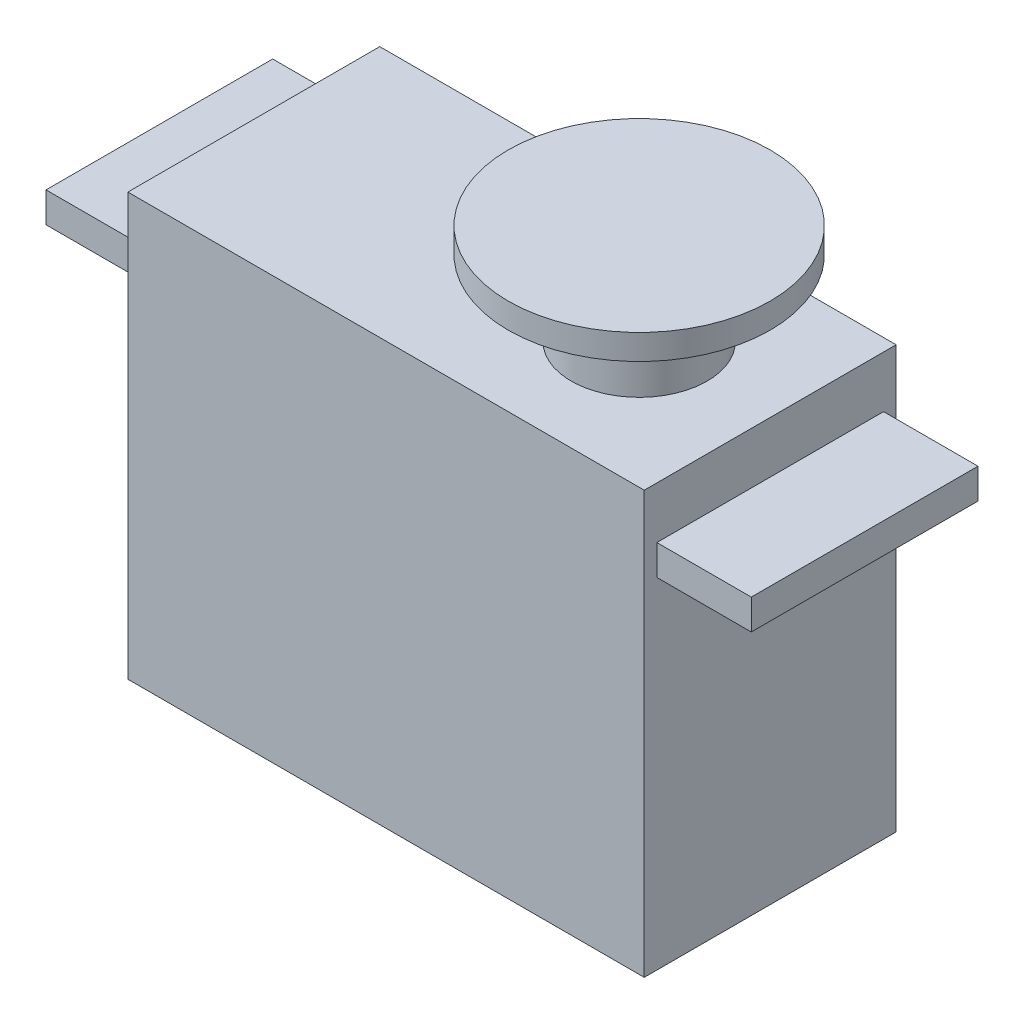
ISO-10303-21;
HEADER;
FILE_DESCRIPTION(('STEP AP214'),'2;1');
FILE_NAME('part.step','',(''),(''),'','','');
FILE_SCHEMA(('AUTOMOTIVE_DESIGN { 1 0 10303 214 1 1 1 1 }'));
ENDSEC;
DATA;
#1=APPLICATION_CONTEXT('core data for automotive mechanical design processes');
#2=APPLICATION_PROTOCOL_DEFINITION('international standard','automotive_design',2000,#1);
#3=PRODUCT_CONTEXT('',#1,'mechanical');
#4=PRODUCT('Part','Part','',(#3));
#5=PRODUCT_RELATED_PRODUCT_CATEGORY('part','',(#4));
#6=PRODUCT_DEFINITION_FORMATION('','',#4);
#7=PRODUCT_DEFINITION_CONTEXT('part definition',#1,'design');
#8=PRODUCT_DEFINITION('design','',#6,#7);
#9=PRODUCT_DEFINITION_SHAPE('','',#8);
#10=(LENGTH_UNIT() NAMED_UNIT(*) SI_UNIT(.MILLI.,.METRE.));
#11=(NAMED_UNIT(*) PLANE_ANGLE_UNIT() SI_UNIT($,.RADIAN.));
#12=(NAMED_UNIT(*) SI_UNIT($,.STERADIAN.) SOLID_ANGLE_UNIT());
#13=UNCERTAINTY_MEASURE_WITH_UNIT(LENGTH_MEASURE(1.E-05),#10,'distance_accuracy_value','');
#14=(GEOMETRIC_REPRESENTATION_CONTEXT(3) GLOBAL_UNCERTAINTY_ASSIGNED_CONTEXT((#13)) GLOBAL_UNIT_ASSIGNED_CONTEXT((#10,
#11,#12)) REPRESENTATION_CONTEXT('',''));
#15=CARTESIAN_POINT('',(0.,0.,0.));
#16=DIRECTION('',(0.,0.,1.));
#17=DIRECTION('',(1.,0.,0.));
#18=AXIS2_PLACEMENT_3D('',#15,#16,#17);
#19=CARTESIAN_POINT('',(41.,0.,20.));
#20=DIRECTION('',(-1.,0.,0.));
#21=DIRECTION('',(0.,0.,1.));
#22=AXIS2_PLACEMENT_3D('',#19,#20,#21);
#23=PLANE('',#22);
#24=DIRECTION('',(0.,1.,0.));
#25=VECTOR('',#24,1.);
#26=CARTESIAN_POINT('',(41.,0.,0.));
#27=LINE('',#26,#25);
#28=CARTESIAN_POINT('',(41.,0.,0.));
#29=VERTEX_POINT('',#28);
#30=CARTESIAN_POINT('',(41.,33.5,0.));
#31=VERTEX_POINT('',#30);
#32=EDGE_CURVE('E213',#29,#31,#27,.T.);
#33=ORIENTED_EDGE('',*,*,#32,.T.);
#34=DIRECTION('',(0.,0.,-1.));
#35=VECTOR('',#34,1.);
#36=CARTESIAN_POINT('',(41.,33.5,20.));
#37=LINE('',#36,#35);
#38=CARTESIAN_POINT('',(41.,33.5,20.));
#39=VERTEX_POINT('',#38);
#40=EDGE_CURVE('E218',#39,#31,#37,.T.);
#41=ORIENTED_EDGE('',*,*,#40,.F.);
#42=DIRECTION('',(0.,1.,0.));
#43=VECTOR('',#42,1.);
#44=CARTESIAN_POINT('',(41.,0.,20.));
#45=LINE('',#44,#43);
#46=CARTESIAN_POINT('',(41.,0.,20.));
#47=VERTEX_POINT('',#46);
#48=EDGE_CURVE('E204',#47,#39,#45,.T.);
#49=ORIENTED_EDGE('',*,*,#48,.F.);
#50=DIRECTION('',(0.,0.,-1.));
#51=VECTOR('',#50,1.);
#52=CARTESIAN_POINT('',(41.,0.,20.));
#53=LINE('',#52,#51);
#54=EDGE_CURVE('E44',#47,#29,#53,.T.);
#55=ORIENTED_EDGE('',*,*,#54,.T.);
#56=EDGE_LOOP('',(#33,#41,#49,#55));
#57=FACE_BOUND('',#56,.T.);
#58=DIRECTION('',(0.,-1.,0.));
#59=VECTOR('',#58,1.);
#60=CARTESIAN_POINT('',(41.,27.,19.));
#61=LINE('',#60,#59);
#62=CARTESIAN_POINT('',(41.,29.4,19.));
#63=VERTEX_POINT('',#62);
#64=CARTESIAN_POINT('',(41.,27.,19.));
#65=VERTEX_POINT('',#64);
#66=EDGE_CURVE('E136',#63,#65,#61,.T.);
#67=ORIENTED_EDGE('',*,*,#66,.F.);
#68=DIRECTION('',(0.,0.,1.));
#69=VECTOR('',#68,1.);
#70=CARTESIAN_POINT('',(41.,29.4,19.));
#71=LINE('',#70,#69);
#72=CARTESIAN_POINT('',(41.,29.4,1.));
#73=VERTEX_POINT('',#72);
#74=EDGE_CURVE('E172',#73,#63,#71,.T.);
#75=ORIENTED_EDGE('',*,*,#74,.F.);
#76=DIRECTION('',(0.,1.,0.));
#77=VECTOR('',#76,1.);
#78=CARTESIAN_POINT('',(41.,27.,1.));
#79=LINE('',#78,#77);
#80=CARTESIAN_POINT('',(41.,27.,1.));
#81=VERTEX_POINT('',#80);
#82=EDGE_CURVE('E182',#81,#73,#79,.T.);
#83=ORIENTED_EDGE('',*,*,#82,.F.);
#84=DIRECTION('',(0.,0.,-1.));
#85=VECTOR('',#84,1.);
#86=CARTESIAN_POINT('',(41.,27.,19.));
#87=LINE('',#86,#85);
#88=EDGE_CURVE('E59',#65,#81,#87,.T.);
#89=ORIENTED_EDGE('',*,*,#88,.F.);
#90=EDGE_LOOP('',(#67,#75,#83,#89));
#91=FACE_BOUND('',#90,.T.);
#92=ADVANCED_FACE('F36',(#57,#91),#23,.F.);
#93=CARTESIAN_POINT('',(0.,33.5,20.));
#94=DIRECTION('',(1.,0.,0.));
#95=DIRECTION('',(0.,0.,-1.));
#96=AXIS2_PLACEMENT_3D('',#93,#94,#95);
#97=PLANE('',#96);
#98=DIRECTION('',(0.,0.,1.));
#99=VECTOR('',#98,1.);
#100=CARTESIAN_POINT('',(0.,29.4,19.));
#101=LINE('',#100,#99);
#102=CARTESIAN_POINT('',(0.,29.4,1.));
#103=VERTEX_POINT('',#102);
#104=CARTESIAN_POINT('',(0.,29.4,19.));
#105=VERTEX_POINT('',#104);
#106=EDGE_CURVE('E158',#103,#105,#101,.T.);
#107=ORIENTED_EDGE('',*,*,#106,.T.);
#108=DIRECTION('',(0.,-1.,0.));
#109=VECTOR('',#108,1.);
#110=CARTESIAN_POINT('',(0.,27.,19.));
#111=LINE('',#110,#109);
#112=CARTESIAN_POINT('',(0.,27.,19.));
#113=VERTEX_POINT('',#112);
#114=EDGE_CURVE('E131',#105,#113,#111,.T.);
#115=ORIENTED_EDGE('',*,*,#114,.T.);
#116=DIRECTION('',(0.,0.,-1.));
#117=VECTOR('',#116,1.);
#118=CARTESIAN_POINT('',(0.,27.,19.));
#119=LINE('',#118,#117);
#120=CARTESIAN_POINT('',(0.,27.,1.));
#121=VERTEX_POINT('',#120);
#122=EDGE_CURVE('E147',#113,#121,#119,.T.);
#123=ORIENTED_EDGE('',*,*,#122,.T.);
#124=DIRECTION('',(0.,1.,0.));
#125=VECTOR('',#124,1.);
#126=CARTESIAN_POINT('',(0.,27.,1.));
#127=LINE('',#126,#125);
#128=EDGE_CURVE('E51',#121,#103,#127,.T.);
#129=ORIENTED_EDGE('',*,*,#128,.T.);
#130=EDGE_LOOP('',(#107,#115,#123,#129));
#131=FACE_BOUND('',#130,.T.);
#132=DIRECTION('',(0.,-1.,0.));
#133=VECTOR('',#132,1.);
#134=CARTESIAN_POINT('',(0.,33.5,0.));
#135=LINE('',#134,#133);
#136=CARTESIAN_POINT('',(0.,33.5,0.));
#137=VERTEX_POINT('',#136);
#138=CARTESIAN_POINT('',(0.,0.,0.));
#139=VERTEX_POINT('',#138);
#140=EDGE_CURVE('E197',#137,#139,#135,.T.);
#141=ORIENTED_EDGE('',*,*,#140,.T.);
#142=DIRECTION('',(0.,0.,-1.));
#143=VECTOR('',#142,1.);
#144=CARTESIAN_POINT('',(0.,0.,20.));
#145=LINE('',#144,#143);
#146=CARTESIAN_POINT('',(0.,0.,20.));
#147=VERTEX_POINT('',#146);
#148=EDGE_CURVE('E11',#147,#139,#145,.T.);
#149=ORIENTED_EDGE('',*,*,#148,.F.);
#150=DIRECTION('',(0.,-1.,0.));
#151=VECTOR('',#150,1.);
#152=CARTESIAN_POINT('',(0.,33.5,20.));
#153=LINE('',#152,#151);
#154=CARTESIAN_POINT('',(0.,33.5,20.));
#155=VERTEX_POINT('',#154);
#156=EDGE_CURVE('E198',#155,#147,#153,.T.);
#157=ORIENTED_EDGE('',*,*,#156,.F.);
#158=DIRECTION('',(0.,0.,-1.));
#159=VECTOR('',#158,1.);
#160=CARTESIAN_POINT('',(0.,33.5,20.));
#161=LINE('',#160,#159);
#162=EDGE_CURVE('E208',#155,#137,#161,.T.);
#163=ORIENTED_EDGE('',*,*,#162,.T.);
#164=EDGE_LOOP('',(#141,#149,#157,#163));
#165=FACE_BOUND('',#164,.T.);
#166=ADVANCED_FACE('F38',(#131,#165),#97,.F.);
#167=CARTESIAN_POINT('',(0.,0.,20.));
#168=DIRECTION('',(0.,1.,0.));
#169=DIRECTION('',(0.,0.,1.));
#170=AXIS2_PLACEMENT_3D('',#167,#168,#169);
#171=PLANE('',#170);
#172=DIRECTION('',(1.,0.,0.));
#173=VECTOR('',#172,1.);
#174=CARTESIAN_POINT('',(0.,0.,0.));
#175=LINE('',#174,#173);
#176=EDGE_CURVE('E211',#139,#29,#175,.T.);
#177=ORIENTED_EDGE('',*,*,#176,.T.);
#178=ORIENTED_EDGE('',*,*,#54,.F.);
#179=DIRECTION('',(1.,0.,0.));
#180=VECTOR('',#179,1.);
#181=CARTESIAN_POINT('',(0.,0.,20.));
#182=LINE('',#181,#180);
#183=EDGE_CURVE('E201',#147,#47,#182,.T.);
#184=ORIENTED_EDGE('',*,*,#183,.F.);
#185=ORIENTED_EDGE('',*,*,#148,.T.);
#186=EDGE_LOOP('',(#177,#178,#184,#185));
#187=FACE_BOUND('',#186,.T.);
#188=ADVANCED_FACE('F240',(#187),#171,.F.);
#189=CARTESIAN_POINT('',(41.,33.5,20.));
#190=DIRECTION('',(0.,-1.,0.));
#191=DIRECTION('',(1.,0.,0.));
#192=AXIS2_PLACEMENT_3D('',#189,#190,#191);
#193=PLANE('',#192);
#194=CARTESIAN_POINT('',(30.6,33.5,10.));
#195=DIRECTION('',(0.,-1.,0.));
#196=DIRECTION('',(0.,0.,-1.));
#197=AXIS2_PLACEMENT_3D('',#194,#195,#196);
#198=CIRCLE('',#197,5.4);
#199=CARTESIAN_POINT('',(30.6,33.5,4.6));
#200=VERTEX_POINT('',#199);
#201=EDGE_CURVE('E314',#200,#200,#198,.T.);
#202=ORIENTED_EDGE('',*,*,#201,.T.);
#203=EDGE_LOOP('',(#202));
#204=FACE_BOUND('',#203,.T.);
#205=DIRECTION('',(-1.,0.,0.));
#206=VECTOR('',#205,1.);
#207=CARTESIAN_POINT('',(41.,33.5,0.));
#208=LINE('',#207,#206);
#209=EDGE_CURVE('E202',#31,#137,#208,.T.);
#210=ORIENTED_EDGE('',*,*,#209,.T.);
#211=ORIENTED_EDGE('',*,*,#162,.F.);
#212=DIRECTION('',(-1.,0.,0.));
#213=VECTOR('',#212,1.);
#214=CARTESIAN_POINT('',(41.,33.5,20.));
#215=LINE('',#214,#213);
#216=EDGE_CURVE('E206',#39,#155,#215,.T.);
#217=ORIENTED_EDGE('',*,*,#216,.F.);
#218=ORIENTED_EDGE('',*,*,#40,.T.);
#219=EDGE_LOOP('',(#210,#211,#217,#218));
#220=FACE_BOUND('',#219,.T.);
#221=ADVANCED_FACE('F233',(#204,#220),#193,.F.);
#222=CARTESIAN_POINT('',(0.,0.,20.));
#223=DIRECTION('',(0.,0.,1.));
#224=DIRECTION('',(1.,0.,0.));
#225=AXIS2_PLACEMENT_3D('',#222,#223,#224);
#226=PLANE('',#225);
#227=ORIENTED_EDGE('',*,*,#156,.T.);
#228=ORIENTED_EDGE('',*,*,#183,.T.);
#229=ORIENTED_EDGE('',*,*,#48,.T.);
#230=ORIENTED_EDGE('',*,*,#216,.T.);
#231=EDGE_LOOP('',(#227,#228,#229,#230));
#232=FACE_BOUND('',#231,.T.);
#233=ADVANCED_FACE('F239',(#232),#226,.T.);
#234=CARTESIAN_POINT('',(0.,0.,0.));
#235=DIRECTION('',(0.,0.,1.));
#236=DIRECTION('',(1.,0.,0.));
#237=AXIS2_PLACEMENT_3D('',#234,#235,#236);
#238=PLANE('',#237);
#239=ORIENTED_EDGE('',*,*,#140,.F.);
#240=ORIENTED_EDGE('',*,*,#209,.F.);
#241=ORIENTED_EDGE('',*,*,#32,.F.);
#242=ORIENTED_EDGE('',*,*,#176,.F.);
#243=EDGE_LOOP('',(#239,#240,#241,#242));
#244=FACE_BOUND('',#243,.T.);
#245=ADVANCED_FACE('F230',(#244),#238,.F.);
#246=CARTESIAN_POINT('',(48.5,27.,19.));
#247=DIRECTION('',(0.,0.,-1.));
#248=DIRECTION('',(-1.,0.,0.));
#249=AXIS2_PLACEMENT_3D('',#246,#247,#248);
#250=PLANE('',#249);
#251=ORIENTED_EDGE('',*,*,#66,.T.);
#252=DIRECTION('',(-1.,0.,0.));
#253=VECTOR('',#252,1.);
#254=CARTESIAN_POINT('',(48.5,27.,19.));
#255=LINE('',#254,#253);
#256=CARTESIAN_POINT('',(48.5,27.,19.));
#257=VERTEX_POINT('',#256);
#258=EDGE_CURVE('E195',#257,#65,#255,.T.);
#259=ORIENTED_EDGE('',*,*,#258,.F.);
#260=DIRECTION('',(0.,-1.,0.));
#261=VECTOR('',#260,1.);
#262=CARTESIAN_POINT('',(48.5,27.,19.));
#263=LINE('',#262,#261);
#264=CARTESIAN_POINT('',(48.5,29.4,19.));
#265=VERTEX_POINT('',#264);
#266=EDGE_CURVE('E168',#265,#257,#263,.T.);
#267=ORIENTED_EDGE('',*,*,#266,.F.);
#268=DIRECTION('',(-1.,0.,0.));
#269=VECTOR('',#268,1.);
#270=CARTESIAN_POINT('',(48.5,29.4,19.));
#271=LINE('',#270,#269);
#272=EDGE_CURVE('E178',#265,#63,#271,.T.);
#273=ORIENTED_EDGE('',*,*,#272,.T.);
#274=EDGE_LOOP('',(#251,#259,#267,#273));
#275=FACE_BOUND('',#274,.T.);
#276=ADVANCED_FACE('F256',(#275),#250,.F.);
#277=CARTESIAN_POINT('',(48.5,27.,19.));
#278=DIRECTION('',(0.,1.,0.));
#279=DIRECTION('',(0.,0.,1.));
#280=AXIS2_PLACEMENT_3D('',#277,#278,#279);
#281=PLANE('',#280);
#282=ORIENTED_EDGE('',*,*,#88,.T.);
#283=DIRECTION('',(-1.,0.,0.));
#284=VECTOR('',#283,1.);
#285=CARTESIAN_POINT('',(48.5,27.,1.));
#286=LINE('',#285,#284);
#287=CARTESIAN_POINT('',(48.5,27.,1.));
#288=VERTEX_POINT('',#287);
#289=EDGE_CURVE('E192',#288,#81,#286,.T.);
#290=ORIENTED_EDGE('',*,*,#289,.F.);
#291=DIRECTION('',(0.,0.,-1.));
#292=VECTOR('',#291,1.);
#293=CARTESIAN_POINT('',(48.5,27.,19.));
#294=LINE('',#293,#292);
#295=EDGE_CURVE('E171',#257,#288,#294,.T.);
#296=ORIENTED_EDGE('',*,*,#295,.F.);
#297=ORIENTED_EDGE('',*,*,#258,.T.);
#298=EDGE_LOOP('',(#282,#290,#296,#297));
#299=FACE_BOUND('',#298,.T.);
#300=ADVANCED_FACE('F261',(#299),#281,.F.);
#301=CARTESIAN_POINT('',(48.5,27.,1.));
#302=DIRECTION('',(0.,0.,1.));
#303=DIRECTION('',(1.,0.,0.));
#304=AXIS2_PLACEMENT_3D('',#301,#302,#303);
#305=PLANE('',#304);
#306=ORIENTED_EDGE('',*,*,#82,.T.);
#307=DIRECTION('',(-1.,0.,0.));
#308=VECTOR('',#307,1.);
#309=CARTESIAN_POINT('',(48.5,29.4,1.));
#310=LINE('',#309,#308);
#311=CARTESIAN_POINT('',(48.5,29.4,1.));
#312=VERTEX_POINT('',#311);
#313=EDGE_CURVE('E189',#312,#73,#310,.T.);
#314=ORIENTED_EDGE('',*,*,#313,.F.);
#315=DIRECTION('',(0.,1.,0.));
#316=VECTOR('',#315,1.);
#317=CARTESIAN_POINT('',(48.5,27.,1.));
#318=LINE('',#317,#316);
#319=EDGE_CURVE('E174',#288,#312,#318,.T.);
#320=ORIENTED_EDGE('',*,*,#319,.F.);
#321=ORIENTED_EDGE('',*,*,#289,.T.);
#322=EDGE_LOOP('',(#306,#314,#320,#321));
#323=FACE_BOUND('',#322,.T.);
#324=ADVANCED_FACE('F265',(#323),#305,.F.);
#325=CARTESIAN_POINT('',(48.5,29.4,19.));
#326=DIRECTION('',(0.,-1.,0.));
#327=DIRECTION('',(0.,0.,-1.));
#328=AXIS2_PLACEMENT_3D('',#325,#326,#327);
#329=PLANE('',#328);
#330=ORIENTED_EDGE('',*,*,#74,.T.);
#331=ORIENTED_EDGE('',*,*,#272,.F.);
#332=DIRECTION('',(0.,0.,1.));
#333=VECTOR('',#332,1.);
#334=CARTESIAN_POINT('',(48.5,29.4,19.));
#335=LINE('',#334,#333);
#336=EDGE_CURVE('E176',#312,#265,#335,.T.);
#337=ORIENTED_EDGE('',*,*,#336,.F.);
#338=ORIENTED_EDGE('',*,*,#313,.T.);
#339=EDGE_LOOP('',(#330,#331,#337,#338));
#340=FACE_BOUND('',#339,.T.);
#341=ADVANCED_FACE('F269',(#340),#329,.F.);
#342=CARTESIAN_POINT('',(48.5,0.,0.));
#343=DIRECTION('',(-1.,0.,0.));
#344=DIRECTION('',(0.,0.,1.));
#345=AXIS2_PLACEMENT_3D('',#342,#343,#344);
#346=PLANE('',#345);
#347=ORIENTED_EDGE('',*,*,#266,.T.);
#348=ORIENTED_EDGE('',*,*,#295,.T.);
#349=ORIENTED_EDGE('',*,*,#319,.T.);
#350=ORIENTED_EDGE('',*,*,#336,.T.);
#351=EDGE_LOOP('',(#347,#348,#349,#350));
#352=FACE_BOUND('',#351,.T.);
#353=ADVANCED_FACE('F273',(#352),#346,.F.);
#354=CARTESIAN_POINT('',(-7.5,27.,19.));
#355=DIRECTION('',(0.,0.,1.));
#356=DIRECTION('',(1.,0.,0.));
#357=AXIS2_PLACEMENT_3D('',#354,#355,#356);
#358=PLANE('',#357);
#359=ORIENTED_EDGE('',*,*,#114,.F.);
#360=DIRECTION('',(1.,0.,0.));
#361=VECTOR('',#360,1.);
#362=CARTESIAN_POINT('',(-7.5,29.4,19.));
#363=LINE('',#362,#361);
#364=CARTESIAN_POINT('',(-7.5,29.4,19.));
#365=VERTEX_POINT('',#364);
#366=EDGE_CURVE('E125',#365,#105,#363,.T.);
#367=ORIENTED_EDGE('',*,*,#366,.F.);
#368=DIRECTION('',(0.,-1.,0.));
#369=VECTOR('',#368,1.);
#370=CARTESIAN_POINT('',(-7.5,27.,19.));
#371=LINE('',#370,#369);
#372=CARTESIAN_POINT('',(-7.5,27.,19.));
#373=VERTEX_POINT('',#372);
#374=EDGE_CURVE('E128',#365,#373,#371,.T.);
#375=ORIENTED_EDGE('',*,*,#374,.T.);
#376=DIRECTION('',(1.,0.,0.));
#377=VECTOR('',#376,1.);
#378=CARTESIAN_POINT('',(-7.5,27.,19.));
#379=LINE('',#378,#377);
#380=EDGE_CURVE('E156',#373,#113,#379,.T.);
#381=ORIENTED_EDGE('',*,*,#380,.T.);
#382=EDGE_LOOP('',(#359,#367,#375,#381));
#383=FACE_BOUND('',#382,.T.);
#384=ADVANCED_FACE('F127',(#383),#358,.T.);
#385=CARTESIAN_POINT('',(-7.5,29.4,19.));
#386=DIRECTION('',(0.,1.,0.));
#387=DIRECTION('',(0.,0.,1.));
#388=AXIS2_PLACEMENT_3D('',#385,#386,#387);
#389=PLANE('',#388);
#390=ORIENTED_EDGE('',*,*,#106,.F.);
#391=DIRECTION('',(1.,0.,0.));
#392=VECTOR('',#391,1.);
#393=CARTESIAN_POINT('',(-7.5,29.4,1.));
#394=LINE('',#393,#392);
#395=CARTESIAN_POINT('',(-7.5,29.4,1.));
#396=VERTEX_POINT('',#395);
#397=EDGE_CURVE('E137',#396,#103,#394,.T.);
#398=ORIENTED_EDGE('',*,*,#397,.F.);
#399=DIRECTION('',(0.,0.,1.));
#400=VECTOR('',#399,1.);
#401=CARTESIAN_POINT('',(-7.5,29.4,19.));
#402=LINE('',#401,#400);
#403=EDGE_CURVE('E143',#396,#365,#402,.T.);
#404=ORIENTED_EDGE('',*,*,#403,.T.);
#405=ORIENTED_EDGE('',*,*,#366,.T.);
#406=EDGE_LOOP('',(#390,#398,#404,#405));
#407=FACE_BOUND('',#406,.T.);
#408=ADVANCED_FACE('F149',(#407),#389,.T.);
#409=CARTESIAN_POINT('',(-7.5,27.,1.));
#410=DIRECTION('',(0.,0.,-1.));
#411=DIRECTION('',(-1.,0.,0.));
#412=AXIS2_PLACEMENT_3D('',#409,#410,#411);
#413=PLANE('',#412);
#414=ORIENTED_EDGE('',*,*,#128,.F.);
#415=DIRECTION('',(1.,0.,0.));
#416=VECTOR('',#415,1.);
#417=CARTESIAN_POINT('',(-7.5,27.,1.));
#418=LINE('',#417,#416);
#419=CARTESIAN_POINT('',(-7.5,27.,1.));
#420=VERTEX_POINT('',#419);
#421=EDGE_CURVE('E165',#420,#121,#418,.T.);
#422=ORIENTED_EDGE('',*,*,#421,.F.);
#423=DIRECTION('',(0.,1.,0.));
#424=VECTOR('',#423,1.);
#425=CARTESIAN_POINT('',(-7.5,27.,1.));
#426=LINE('',#425,#424);
#427=EDGE_CURVE('E150',#420,#396,#426,.T.);
#428=ORIENTED_EDGE('',*,*,#427,.T.);
#429=ORIENTED_EDGE('',*,*,#397,.T.);
#430=EDGE_LOOP('',(#414,#422,#428,#429));
#431=FACE_BOUND('',#430,.T.);
#432=ADVANCED_FACE('F282',(#431),#413,.T.);
#433=CARTESIAN_POINT('',(-7.5,27.,19.));
#434=DIRECTION('',(0.,-1.,0.));
#435=DIRECTION('',(0.,0.,-1.));
#436=AXIS2_PLACEMENT_3D('',#433,#434,#435);
#437=PLANE('',#436);
#438=ORIENTED_EDGE('',*,*,#122,.F.);
#439=ORIENTED_EDGE('',*,*,#380,.F.);
#440=DIRECTION('',(0.,0.,-1.));
#441=VECTOR('',#440,1.);
#442=CARTESIAN_POINT('',(-7.5,27.,19.));
#443=LINE('',#442,#441);
#444=EDGE_CURVE('E146',#373,#420,#443,.T.);
#445=ORIENTED_EDGE('',*,*,#444,.T.);
#446=ORIENTED_EDGE('',*,*,#421,.T.);
#447=EDGE_LOOP('',(#438,#439,#445,#446));
#448=FACE_BOUND('',#447,.T.);
#449=ADVANCED_FACE('F285',(#448),#437,.T.);
#450=CARTESIAN_POINT('',(-7.5,0.,0.));
#451=DIRECTION('',(1.,0.,0.));
#452=DIRECTION('',(0.,0.,1.));
#453=AXIS2_PLACEMENT_3D('',#450,#451,#452);
#454=PLANE('',#453);
#455=ORIENTED_EDGE('',*,*,#374,.F.);
#456=ORIENTED_EDGE('',*,*,#403,.F.);
#457=ORIENTED_EDGE('',*,*,#427,.F.);
#458=ORIENTED_EDGE('',*,*,#444,.F.);
#459=EDGE_LOOP('',(#455,#456,#457,#458));
#460=FACE_BOUND('',#459,.T.);
#461=ADVANCED_FACE('F141',(#460),#454,.F.);
#462=CARTESIAN_POINT('',(30.6,41.5,10.));
#463=DIRECTION('',(0.,1.,0.));
#464=DIRECTION('',(0.,0.,1.));
#465=AXIS2_PLACEMENT_3D('',#462,#463,#464);
#466=PLANE('',#465);
#467=CARTESIAN_POINT('',(30.6,41.5,10.));
#468=DIRECTION('',(0.,-1.,0.));
#469=DIRECTION('',(0.,0.,-1.));
#470=AXIS2_PLACEMENT_3D('',#467,#468,#469);
#471=CIRCLE('',#470,10.4);
#472=CARTESIAN_POINT('',(30.6,41.5,-0.399999999999999));
#473=VERTEX_POINT('',#472);
#474=EDGE_CURVE('E159',#473,#473,#471,.T.);
#475=ORIENTED_EDGE('',*,*,#474,.F.);
#476=EDGE_LOOP('',(#475));
#477=FACE_BOUND('',#476,.T.);
#478=ADVANCED_FACE('F291',(#477),#466,.T.);
#479=CARTESIAN_POINT('',(30.6,33.5,10.));
#480=DIRECTION('',(0.,-1.,0.));
#481=DIRECTION('',(0.,0.,-1.));
#482=AXIS2_PLACEMENT_3D('',#479,#480,#481);
#483=CYLINDRICAL_SURFACE('',#482,10.4);
#484=ORIENTED_EDGE('',*,*,#474,.T.);
#485=EDGE_LOOP('',(#484));
#486=FACE_BOUND('',#485,.T.);
#487=CARTESIAN_POINT('',(30.6,39.5,10.));
#488=DIRECTION('',(0.,-1.,0.));
#489=DIRECTION('',(0.,0.,-1.));
#490=AXIS2_PLACEMENT_3D('',#487,#488,#489);
#491=CIRCLE('',#490,10.4);
#492=CARTESIAN_POINT('',(30.6,39.5,-0.399999999999999));
#493=VERTEX_POINT('',#492);
#494=EDGE_CURVE('E316',#493,#493,#491,.T.);
#495=ORIENTED_EDGE('',*,*,#494,.F.);
#496=EDGE_LOOP('',(#495));
#497=FACE_BOUND('',#496,.T.);
#498=ADVANCED_FACE('F294',(#486,#497),#483,.T.);
#499=CARTESIAN_POINT('',(41.,39.5,10.));
#500=DIRECTION('',(0.,-1.,0.));
#501=DIRECTION('',(0.,0.,-1.));
#502=AXIS2_PLACEMENT_3D('',#499,#500,#501);
#503=PLANE('',#502);
#504=ORIENTED_EDGE('',*,*,#494,.T.);
#505=EDGE_LOOP('',(#504));
#506=FACE_BOUND('',#505,.T.);
#507=CARTESIAN_POINT('',(30.6,39.5,10.));
#508=DIRECTION('',(0.,-1.,0.));
#509=DIRECTION('',(0.,0.,-1.));
#510=AXIS2_PLACEMENT_3D('',#507,#508,#509);
#511=CIRCLE('',#510,5.4);
#512=CARTESIAN_POINT('',(30.6,39.5,4.6));
#513=VERTEX_POINT('',#512);
#514=EDGE_CURVE('E311',#513,#513,#511,.T.);
#515=ORIENTED_EDGE('',*,*,#514,.F.);
#516=EDGE_LOOP('',(#515));
#517=FACE_BOUND('',#516,.T.);
#518=ADVANCED_FACE('F298',(#506,#517),#503,.T.);
#519=CARTESIAN_POINT('',(30.6,33.5,10.));
#520=DIRECTION('',(0.,-1.,0.));
#521=DIRECTION('',(0.,0.,-1.));
#522=AXIS2_PLACEMENT_3D('',#519,#520,#521);
#523=CYLINDRICAL_SURFACE('',#522,5.4);
#524=ORIENTED_EDGE('',*,*,#514,.T.);
#525=EDGE_LOOP('',(#524));
#526=FACE_BOUND('',#525,.T.);
#527=ORIENTED_EDGE('',*,*,#201,.F.);
#528=EDGE_LOOP('',(#527));
#529=FACE_BOUND('',#528,.T.);
#530=ADVANCED_FACE('F302',(#526,#529),#523,.T.);
#531=CLOSED_SHELL('',(#92,#166,#188,#221,#233,#245,#276,#300,#324,#341,#353,#384,#408,#432,#449,
#461,#478,#498,#518,#530));
#532=MANIFOLD_SOLID_BREP('B2',#531);
#533=ADVANCED_BREP_SHAPE_REPRESENTATION('',(#18,#532),#14);
#534=SHAPE_DEFINITION_REPRESENTATION(#9,#533);
ENDSEC;
END-ISO-10303-21;
